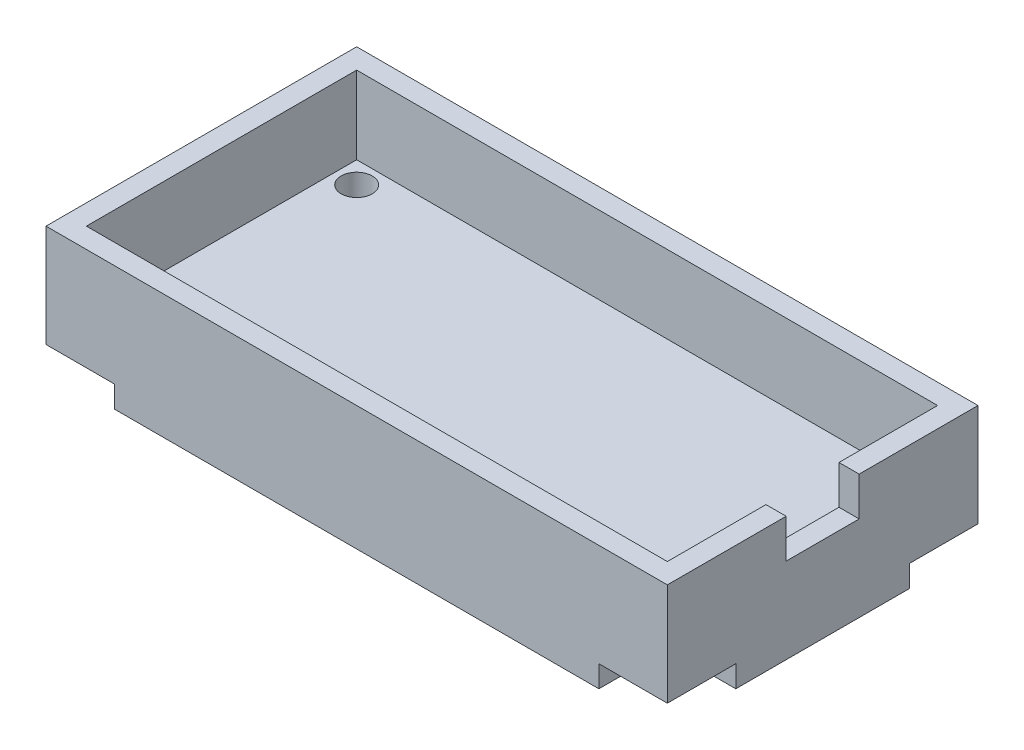
ISO-10303-21;
HEADER;
FILE_DESCRIPTION(('STEP AP214'),'2;1');
FILE_NAME('part.step','',(''),(''),'','','');
FILE_SCHEMA(('AUTOMOTIVE_DESIGN { 1 0 10303 214 1 1 1 1 }'));
ENDSEC;
DATA;
#1=APPLICATION_CONTEXT('core data for automotive mechanical design processes');
#2=APPLICATION_PROTOCOL_DEFINITION('international standard','automotive_design',2000,#1);
#3=PRODUCT_CONTEXT('',#1,'mechanical');
#4=PRODUCT('Part','Part','',(#3));
#5=PRODUCT_RELATED_PRODUCT_CATEGORY('part','',(#4));
#6=PRODUCT_DEFINITION_FORMATION('','',#4);
#7=PRODUCT_DEFINITION_CONTEXT('part definition',#1,'design');
#8=PRODUCT_DEFINITION('design','',#6,#7);
#9=PRODUCT_DEFINITION_SHAPE('','',#8);
#10=(LENGTH_UNIT() NAMED_UNIT(*) SI_UNIT(.MILLI.,.METRE.));
#11=(NAMED_UNIT(*) PLANE_ANGLE_UNIT() SI_UNIT($,.RADIAN.));
#12=(NAMED_UNIT(*) SI_UNIT($,.STERADIAN.) SOLID_ANGLE_UNIT());
#13=UNCERTAINTY_MEASURE_WITH_UNIT(LENGTH_MEASURE(1.E-05),#10,'distance_accuracy_value','');
#14=(GEOMETRIC_REPRESENTATION_CONTEXT(3) GLOBAL_UNCERTAINTY_ASSIGNED_CONTEXT((#13)) GLOBAL_UNIT_ASSIGNED_CONTEXT((#10,
#11,#12)) REPRESENTATION_CONTEXT('',''));
#15=CARTESIAN_POINT('',(0.,0.,0.));
#16=DIRECTION('',(0.,0.,1.));
#17=DIRECTION('',(1.,0.,0.));
#18=AXIS2_PLACEMENT_3D('',#15,#16,#17);
#19=CARTESIAN_POINT('',(2.7,8.,7.3));
#20=DIRECTION('',(0.,-1.,0.));
#21=DIRECTION('',(0.,0.,-1.));
#22=AXIS2_PLACEMENT_3D('',#19,#20,#21);
#23=CYLINDRICAL_SURFACE('',#22,0.999999999999998);
#24=CARTESIAN_POINT('',(2.7,3.,7.3));
#25=DIRECTION('',(0.,-1.,0.));
#26=DIRECTION('',(0.,0.,-1.));
#27=AXIS2_PLACEMENT_3D('',#24,#25,#26);
#28=CIRCLE('',#27,0.999999999999998);
#29=CARTESIAN_POINT('',(2.7,3.,6.3));
#30=VERTEX_POINT('',#29);
#31=EDGE_CURVE('E443',#30,#30,#28,.T.);
#32=ORIENTED_EDGE('',*,*,#31,.F.);
#33=EDGE_LOOP('',(#32));
#34=FACE_BOUND('',#33,.T.);
#35=CARTESIAN_POINT('',(2.7,1.4,7.3));
#36=DIRECTION('',(0.,-1.,0.));
#37=DIRECTION('',(0.,0.,-1.));
#38=AXIS2_PLACEMENT_3D('',#35,#36,#37);
#39=CIRCLE('',#38,0.999999999999998);
#40=CARTESIAN_POINT('',(2.7,1.4,6.3));
#41=VERTEX_POINT('',#40);
#42=EDGE_CURVE('E278',#41,#41,#39,.F.);
#43=ORIENTED_EDGE('',*,*,#42,.F.);
#44=EDGE_LOOP('',(#43));
#45=FACE_BOUND('',#44,.T.);
#46=ADVANCED_FACE('F31',(#34,#45),#23,.F.);
#47=CARTESIAN_POINT('',(37.3,8.,-7.29999999999999));
#48=DIRECTION('',(0.,-1.,0.));
#49=DIRECTION('',(0.,0.,-1.));
#50=AXIS2_PLACEMENT_3D('',#47,#48,#49);
#51=CYLINDRICAL_SURFACE('',#50,0.999999999999998);
#52=CARTESIAN_POINT('',(37.3,3.,-7.29999999999999));
#53=DIRECTION('',(0.,-1.,0.));
#54=DIRECTION('',(0.,0.,-1.));
#55=AXIS2_PLACEMENT_3D('',#52,#53,#54);
#56=CIRCLE('',#55,0.999999999999998);
#57=CARTESIAN_POINT('',(37.3,3.,-8.29999999999999));
#58=VERTEX_POINT('',#57);
#59=EDGE_CURVE('E437',#58,#58,#56,.T.);
#60=ORIENTED_EDGE('',*,*,#59,.F.);
#61=EDGE_LOOP('',(#60));
#62=FACE_BOUND('',#61,.T.);
#63=CARTESIAN_POINT('',(37.3,1.4,-7.29999999999999));
#64=DIRECTION('',(0.,-1.,0.));
#65=DIRECTION('',(0.,0.,-1.));
#66=AXIS2_PLACEMENT_3D('',#63,#64,#65);
#67=CIRCLE('',#66,0.999999999999998);
#68=CARTESIAN_POINT('',(37.3,1.4,-8.29999999999999));
#69=VERTEX_POINT('',#68);
#70=EDGE_CURVE('E343',#69,#69,#67,.F.);
#71=ORIENTED_EDGE('',*,*,#70,.F.);
#72=EDGE_LOOP('',(#71));
#73=FACE_BOUND('',#72,.T.);
#74=ADVANCED_FACE('F455',(#62,#73),#51,.F.);
#75=CARTESIAN_POINT('',(0.,8.,10.));
#76=DIRECTION('',(1.,0.,0.));
#77=DIRECTION('',(0.,1.,0.));
#78=AXIS2_PLACEMENT_3D('',#75,#76,#77);
#79=PLANE('',#78);
#80=DIRECTION('',(0.,0.,-1.));
#81=VECTOR('',#80,1.);
#82=CARTESIAN_POINT('',(0.,1.4,-10.));
#83=LINE('',#82,#81);
#84=CARTESIAN_POINT('',(0.,1.4,-5.59289321881345));
#85=VERTEX_POINT('',#84);
#86=CARTESIAN_POINT('',(0.,1.4,-10.));
#87=VERTEX_POINT('',#86);
#88=EDGE_CURVE('E48',#85,#87,#83,.T.);
#89=ORIENTED_EDGE('',*,*,#88,.F.);
#90=DIRECTION('',(0.,-1.,0.));
#91=VECTOR('',#90,1.);
#92=CARTESIAN_POINT('',(0.,1.4,-5.59289321881345));
#93=LINE('',#92,#91);
#94=CARTESIAN_POINT('',(0.,0.,-5.59289321881345));
#95=VERTEX_POINT('',#94);
#96=EDGE_CURVE('E230',#85,#95,#93,.T.);
#97=ORIENTED_EDGE('',*,*,#96,.T.);
#98=DIRECTION('',(0.,0.,-1.));
#99=VECTOR('',#98,1.);
#100=CARTESIAN_POINT('',(0.,0.,10.));
#101=LINE('',#100,#99);
#102=CARTESIAN_POINT('',(0.,0.,5.59289321881346));
#103=VERTEX_POINT('',#102);
#104=EDGE_CURVE('E11',#103,#95,#101,.T.);
#105=ORIENTED_EDGE('',*,*,#104,.F.);
#106=DIRECTION('',(0.,-1.,0.));
#107=VECTOR('',#106,1.);
#108=CARTESIAN_POINT('',(0.,1.4,5.59289321881346));
#109=LINE('',#108,#107);
#110=CARTESIAN_POINT('',(0.,1.4,5.59289321881346));
#111=VERTEX_POINT('',#110);
#112=EDGE_CURVE('E279',#111,#103,#109,.T.);
#113=ORIENTED_EDGE('',*,*,#112,.F.);
#114=DIRECTION('',(0.,0.,-1.));
#115=VECTOR('',#114,1.);
#116=CARTESIAN_POINT('',(0.,1.4,10.));
#117=LINE('',#116,#115);
#118=CARTESIAN_POINT('',(0.,1.4,10.));
#119=VERTEX_POINT('',#118);
#120=EDGE_CURVE('E263',#119,#111,#117,.T.);
#121=ORIENTED_EDGE('',*,*,#120,.F.);
#122=DIRECTION('',(0.,-1.,0.));
#123=VECTOR('',#122,1.);
#124=CARTESIAN_POINT('',(0.,8.,10.));
#125=LINE('',#124,#123);
#126=CARTESIAN_POINT('',(0.,8.,10.));
#127=VERTEX_POINT('',#126);
#128=EDGE_CURVE('E410',#127,#119,#125,.T.);
#129=ORIENTED_EDGE('',*,*,#128,.F.);
#130=DIRECTION('',(0.,0.,-1.));
#131=VECTOR('',#130,1.);
#132=CARTESIAN_POINT('',(0.,8.,10.));
#133=LINE('',#132,#131);
#134=CARTESIAN_POINT('',(0.,8.,-10.));
#135=VERTEX_POINT('',#134);
#136=EDGE_CURVE('E420',#127,#135,#133,.T.);
#137=ORIENTED_EDGE('',*,*,#136,.T.);
#138=DIRECTION('',(0.,-1.,0.));
#139=VECTOR('',#138,1.);
#140=CARTESIAN_POINT('',(0.,8.,-10.));
#141=LINE('',#140,#139);
#142=EDGE_CURVE('E403',#135,#87,#141,.T.);
#143=ORIENTED_EDGE('',*,*,#142,.T.);
#144=EDGE_LOOP('',(#89,#97,#105,#113,#121,#129,#137,#143));
#145=FACE_BOUND('',#144,.T.);
#146=ADVANCED_FACE('F33',(#145),#79,.F.);
#147=CARTESIAN_POINT('',(0.,0.,10.));
#148=DIRECTION('',(0.,1.,0.));
#149=DIRECTION('',(0.,0.,1.));
#150=AXIS2_PLACEMENT_3D('',#147,#148,#149);
#151=PLANE('',#150);
#152=CARTESIAN_POINT('',(3.40710678118655,0.,-6.59289321881345));
#153=DIRECTION('',(0.,-1.,0.));
#154=DIRECTION('',(0.,0.,1.));
#155=AXIS2_PLACEMENT_3D('',#152,#153,#154);
#156=CIRCLE('',#155,1.);
#157=CARTESIAN_POINT('',(4.40710678118656,0.,-6.59289321881345));
#158=VERTEX_POINT('',#157);
#159=CARTESIAN_POINT('',(3.40710678118655,0.,-5.59289321881345));
#160=VERTEX_POINT('',#159);
#161=EDGE_CURVE('E227',#158,#160,#156,.T.);
#162=ORIENTED_EDGE('',*,*,#161,.F.);
#163=DIRECTION('',(0.,0.,1.));
#164=VECTOR('',#163,1.);
#165=CARTESIAN_POINT('',(4.40710678118656,0.,-6.59289321881345));
#166=LINE('',#165,#164);
#167=CARTESIAN_POINT('',(4.40710678118656,0.,-10.));
#168=VERTEX_POINT('',#167);
#169=EDGE_CURVE('E240',#168,#158,#166,.T.);
#170=ORIENTED_EDGE('',*,*,#169,.F.);
#171=DIRECTION('',(1.,0.,0.));
#172=VECTOR('',#171,1.);
#173=CARTESIAN_POINT('',(0.,0.,-10.));
#174=LINE('',#173,#172);
#175=CARTESIAN_POINT('',(35.5928932188135,0.,-10.));
#176=VERTEX_POINT('',#175);
#177=EDGE_CURVE('E423',#168,#176,#174,.T.);
#178=ORIENTED_EDGE('',*,*,#177,.T.);
#179=DIRECTION('',(0.,0.,-1.));
#180=VECTOR('',#179,1.);
#181=CARTESIAN_POINT('',(35.5928932188135,0.,-6.59289321881345));
#182=LINE('',#181,#180);
#183=CARTESIAN_POINT('',(35.5928932188135,0.,-6.59289321881345));
#184=VERTEX_POINT('',#183);
#185=EDGE_CURVE('E321',#184,#176,#182,.T.);
#186=ORIENTED_EDGE('',*,*,#185,.F.);
#187=CARTESIAN_POINT('',(36.5928932188135,0.,-6.59289321881345));
#188=DIRECTION('',(0.,-1.,0.));
#189=DIRECTION('',(0.,0.,-1.));
#190=AXIS2_PLACEMENT_3D('',#187,#188,#189);
#191=CIRCLE('',#190,1.);
#192=CARTESIAN_POINT('',(36.5928932188135,0.,-5.59289321881345));
#193=VERTEX_POINT('',#192);
#194=EDGE_CURVE('E335',#193,#184,#191,.T.);
#195=ORIENTED_EDGE('',*,*,#194,.F.);
#196=DIRECTION('',(-1.,0.,0.));
#197=VECTOR('',#196,1.);
#198=CARTESIAN_POINT('',(40.,0.,-5.59289321881345));
#199=LINE('',#198,#197);
#200=CARTESIAN_POINT('',(40.,0.,-5.59289321881345));
#201=VERTEX_POINT('',#200);
#202=EDGE_CURVE('E332',#201,#193,#199,.T.);
#203=ORIENTED_EDGE('',*,*,#202,.F.);
#204=DIRECTION('',(0.,0.,-1.));
#205=VECTOR('',#204,1.);
#206=CARTESIAN_POINT('',(40.,0.,10.));
#207=LINE('',#206,#205);
#208=CARTESIAN_POINT('',(40.,0.,5.59289321881346));
#209=VERTEX_POINT('',#208);
#210=EDGE_CURVE('E40',#209,#201,#207,.T.);
#211=ORIENTED_EDGE('',*,*,#210,.F.);
#212=DIRECTION('',(1.,0.,0.));
#213=VECTOR('',#212,1.);
#214=CARTESIAN_POINT('',(40.,0.,5.59289321881346));
#215=LINE('',#214,#213);
#216=CARTESIAN_POINT('',(36.5928932188135,0.,5.59289321881346));
#217=VERTEX_POINT('',#216);
#218=EDGE_CURVE('E303',#217,#209,#215,.T.);
#219=ORIENTED_EDGE('',*,*,#218,.F.);
#220=CARTESIAN_POINT('',(36.5928932188135,0.,6.59289321881346));
#221=DIRECTION('',(0.,-1.,0.));
#222=DIRECTION('',(0.,0.,1.));
#223=AXIS2_PLACEMENT_3D('',#220,#221,#222);
#224=CIRCLE('',#223,1.);
#225=CARTESIAN_POINT('',(35.5928932188135,0.,6.59289321881346));
#226=VERTEX_POINT('',#225);
#227=EDGE_CURVE('E300',#226,#217,#224,.T.);
#228=ORIENTED_EDGE('',*,*,#227,.F.);
#229=DIRECTION('',(0.,0.,-1.));
#230=VECTOR('',#229,1.);
#231=CARTESIAN_POINT('',(35.5928932188135,0.,6.59289321881346));
#232=LINE('',#231,#230);
#233=CARTESIAN_POINT('',(35.5928932188135,0.,10.));
#234=VERTEX_POINT('',#233);
#235=EDGE_CURVE('E289',#234,#226,#232,.T.);
#236=ORIENTED_EDGE('',*,*,#235,.F.);
#237=DIRECTION('',(1.,0.,0.));
#238=VECTOR('',#237,1.);
#239=CARTESIAN_POINT('',(0.,0.,10.));
#240=LINE('',#239,#238);
#241=CARTESIAN_POINT('',(4.40710678118655,0.,10.));
#242=VERTEX_POINT('',#241);
#243=EDGE_CURVE('E413',#242,#234,#240,.T.);
#244=ORIENTED_EDGE('',*,*,#243,.F.);
#245=DIRECTION('',(0.,0.,1.));
#246=VECTOR('',#245,1.);
#247=CARTESIAN_POINT('',(4.40710678118656,0.,6.59289321881346));
#248=LINE('',#247,#246);
#249=CARTESIAN_POINT('',(4.40710678118656,0.,6.59289321881346));
#250=VERTEX_POINT('',#249);
#251=EDGE_CURVE('E272',#250,#242,#248,.T.);
#252=ORIENTED_EDGE('',*,*,#251,.F.);
#253=CARTESIAN_POINT('',(3.40710678118655,0.,6.59289321881346));
#254=DIRECTION('',(0.,-1.,0.));
#255=DIRECTION('',(0.,0.,-1.));
#256=AXIS2_PLACEMENT_3D('',#253,#254,#255);
#257=CIRCLE('',#256,1.);
#258=CARTESIAN_POINT('',(3.40710678118655,0.,5.59289321881346));
#259=VERTEX_POINT('',#258);
#260=EDGE_CURVE('E269',#259,#250,#257,.T.);
#261=ORIENTED_EDGE('',*,*,#260,.F.);
#262=DIRECTION('',(1.,0.,0.));
#263=VECTOR('',#262,1.);
#264=CARTESIAN_POINT('',(0.,0.,5.59289321881346));
#265=LINE('',#264,#263);
#266=EDGE_CURVE('E259',#103,#259,#265,.T.);
#267=ORIENTED_EDGE('',*,*,#266,.F.);
#268=ORIENTED_EDGE('',*,*,#104,.T.);
#269=DIRECTION('',(-1.,0.,0.));
#270=VECTOR('',#269,1.);
#271=CARTESIAN_POINT('',(0.,0.,-5.59289321881345));
#272=LINE('',#271,#270);
#273=EDGE_CURVE('E243',#160,#95,#272,.T.);
#274=ORIENTED_EDGE('',*,*,#273,.F.);
#275=EDGE_LOOP('',(#162,#170,#178,#186,#195,#203,#211,#219,#228,#236,#244,#252,#261,#267,#268,#274));
#276=FACE_BOUND('',#275,.T.);
#277=ADVANCED_FACE('F523',(#276),#151,.F.);
#278=CARTESIAN_POINT('',(40.,8.,10.));
#279=DIRECTION('',(-1.,0.,0.));
#280=DIRECTION('',(0.,-1.,0.));
#281=AXIS2_PLACEMENT_3D('',#278,#279,#280);
#282=PLANE('',#281);
#283=DIRECTION('',(0.,0.,1.));
#284=VECTOR('',#283,1.);
#285=CARTESIAN_POINT('',(40.,1.4,10.));
#286=LINE('',#285,#284);
#287=CARTESIAN_POINT('',(40.,1.4,5.59289321881346));
#288=VERTEX_POINT('',#287);
#289=CARTESIAN_POINT('',(40.,1.4,10.));
#290=VERTEX_POINT('',#289);
#291=EDGE_CURVE('E292',#288,#290,#286,.T.);
#292=ORIENTED_EDGE('',*,*,#291,.F.);
#293=DIRECTION('',(0.,-1.,0.));
#294=VECTOR('',#293,1.);
#295=CARTESIAN_POINT('',(40.,1.4,5.59289321881346));
#296=LINE('',#295,#294);
#297=EDGE_CURVE('E313',#288,#209,#296,.T.);
#298=ORIENTED_EDGE('',*,*,#297,.T.);
#299=ORIENTED_EDGE('',*,*,#210,.T.);
#300=DIRECTION('',(0.,-1.,0.));
#301=VECTOR('',#300,1.);
#302=CARTESIAN_POINT('',(40.,1.4,-5.59289321881345));
#303=LINE('',#302,#301);
#304=CARTESIAN_POINT('',(40.,1.4,-5.59289321881345));
#305=VERTEX_POINT('',#304);
#306=EDGE_CURVE('E331',#305,#201,#303,.T.);
#307=ORIENTED_EDGE('',*,*,#306,.F.);
#308=DIRECTION('',(0.,0.,1.));
#309=VECTOR('',#308,1.);
#310=CARTESIAN_POINT('',(40.,1.4,-10.));
#311=LINE('',#310,#309);
#312=CARTESIAN_POINT('',(40.,1.4,-10.));
#313=VERTEX_POINT('',#312);
#314=EDGE_CURVE('E317',#313,#305,#311,.T.);
#315=ORIENTED_EDGE('',*,*,#314,.F.);
#316=DIRECTION('',(0.,1.,0.));
#317=VECTOR('',#316,1.);
#318=CARTESIAN_POINT('',(40.,8.,-10.));
#319=LINE('',#318,#317);
#320=CARTESIAN_POINT('',(40.,8.,-10.));
#321=VERTEX_POINT('',#320);
#322=EDGE_CURVE('E425',#313,#321,#319,.T.);
#323=ORIENTED_EDGE('',*,*,#322,.T.);
#324=DIRECTION('',(0.,0.,-1.));
#325=VECTOR('',#324,1.);
#326=CARTESIAN_POINT('',(40.,8.,10.));
#327=LINE('',#326,#325);
#328=CARTESIAN_POINT('',(40.,8.,-2.35));
#329=VERTEX_POINT('',#328);
#330=EDGE_CURVE('E430',#329,#321,#327,.T.);
#331=ORIENTED_EDGE('',*,*,#330,.F.);
#332=DIRECTION('',(0.,1.,0.));
#333=VECTOR('',#332,1.);
#334=CARTESIAN_POINT('',(40.,5.5,-2.35));
#335=LINE('',#334,#333);
#336=CARTESIAN_POINT('',(40.,5.5,-2.35));
#337=VERTEX_POINT('',#336);
#338=EDGE_CURVE('E361',#337,#329,#335,.T.);
#339=ORIENTED_EDGE('',*,*,#338,.F.);
#340=DIRECTION('',(0.,0.,-1.));
#341=VECTOR('',#340,1.);
#342=CARTESIAN_POINT('',(40.,5.5,-2.35));
#343=LINE('',#342,#341);
#344=CARTESIAN_POINT('',(40.,5.5,2.35));
#345=VERTEX_POINT('',#344);
#346=EDGE_CURVE('E350',#345,#337,#343,.T.);
#347=ORIENTED_EDGE('',*,*,#346,.F.);
#348=DIRECTION('',(0.,1.,0.));
#349=VECTOR('',#348,1.);
#350=CARTESIAN_POINT('',(40.,5.5,2.35));
#351=LINE('',#350,#349);
#352=CARTESIAN_POINT('',(40.,8.,2.35));
#353=VERTEX_POINT('',#352);
#354=EDGE_CURVE('E366',#345,#353,#351,.T.);
#355=ORIENTED_EDGE('',*,*,#354,.T.);
#356=CARTESIAN_POINT('',(40.,8.,10.));
#357=VERTEX_POINT('',#356);
#358=EDGE_CURVE('E431',#357,#353,#327,.T.);
#359=ORIENTED_EDGE('',*,*,#358,.F.);
#360=DIRECTION('',(0.,1.,0.));
#361=VECTOR('',#360,1.);
#362=CARTESIAN_POINT('',(40.,8.,10.));
#363=LINE('',#362,#361);
#364=EDGE_CURVE('E416',#290,#357,#363,.T.);
#365=ORIENTED_EDGE('',*,*,#364,.F.);
#366=EDGE_LOOP('',(#292,#298,#299,#307,#315,#323,#331,#339,#347,#355,#359,#365));
#367=FACE_BOUND('',#366,.T.);
#368=ADVANCED_FACE('F520',(#367),#282,.F.);
#369=CARTESIAN_POINT('',(0.,8.,10.));
#370=DIRECTION('',(0.,-1.,0.));
#371=DIRECTION('',(0.,0.,-1.));
#372=AXIS2_PLACEMENT_3D('',#369,#370,#371);
#373=PLANE('',#372);
#374=ORIENTED_EDGE('',*,*,#358,.T.);
#375=DIRECTION('',(1.,0.,0.));
#376=VECTOR('',#375,1.);
#377=CARTESIAN_POINT('',(40.,8.,2.35));
#378=LINE('',#377,#376);
#379=CARTESIAN_POINT('',(38.7,8.,2.35));
#380=VERTEX_POINT('',#379);
#381=EDGE_CURVE('E354',#380,#353,#378,.T.);
#382=ORIENTED_EDGE('',*,*,#381,.F.);
#383=DIRECTION('',(0.,0.,-1.));
#384=VECTOR('',#383,1.);
#385=CARTESIAN_POINT('',(38.7,8.,-8.7));
#386=LINE('',#385,#384);
#387=CARTESIAN_POINT('',(38.7,8.,8.7));
#388=VERTEX_POINT('',#387);
#389=EDGE_CURVE('E390',#388,#380,#386,.T.);
#390=ORIENTED_EDGE('',*,*,#389,.F.);
#391=DIRECTION('',(1.,0.,0.));
#392=VECTOR('',#391,1.);
#393=CARTESIAN_POINT('',(38.7,8.,8.7));
#394=LINE('',#393,#392);
#395=CARTESIAN_POINT('',(1.30000000000001,8.,8.7));
#396=VERTEX_POINT('',#395);
#397=EDGE_CURVE('E380',#396,#388,#394,.T.);
#398=ORIENTED_EDGE('',*,*,#397,.F.);
#399=DIRECTION('',(0.,0.,1.));
#400=VECTOR('',#399,1.);
#401=CARTESIAN_POINT('',(1.30000000000001,8.,-8.7));
#402=LINE('',#401,#400);
#403=CARTESIAN_POINT('',(1.30000000000001,8.,-8.7));
#404=VERTEX_POINT('',#403);
#405=EDGE_CURVE('E396',#404,#396,#402,.T.);
#406=ORIENTED_EDGE('',*,*,#405,.F.);
#407=DIRECTION('',(-1.,0.,0.));
#408=VECTOR('',#407,1.);
#409=CARTESIAN_POINT('',(38.7,8.,-8.7));
#410=LINE('',#409,#408);
#411=CARTESIAN_POINT('',(38.7,8.,-8.7));
#412=VERTEX_POINT('',#411);
#413=EDGE_CURVE('E393',#412,#404,#410,.T.);
#414=ORIENTED_EDGE('',*,*,#413,.F.);
#415=CARTESIAN_POINT('',(38.7,8.,-2.35));
#416=VERTEX_POINT('',#415);
#417=EDGE_CURVE('E369',#416,#412,#386,.T.);
#418=ORIENTED_EDGE('',*,*,#417,.F.);
#419=DIRECTION('',(-1.,0.,0.));
#420=VECTOR('',#419,1.);
#421=CARTESIAN_POINT('',(40.,8.,-2.35));
#422=LINE('',#421,#420);
#423=EDGE_CURVE('E362',#329,#416,#422,.T.);
#424=ORIENTED_EDGE('',*,*,#423,.F.);
#425=ORIENTED_EDGE('',*,*,#330,.T.);
#426=DIRECTION('',(-1.,0.,0.));
#427=VECTOR('',#426,1.);
#428=CARTESIAN_POINT('',(0.,8.,-10.));
#429=LINE('',#428,#427);
#430=EDGE_CURVE('E414',#321,#135,#429,.T.);
#431=ORIENTED_EDGE('',*,*,#430,.T.);
#432=ORIENTED_EDGE('',*,*,#136,.F.);
#433=DIRECTION('',(-1.,0.,0.));
#434=VECTOR('',#433,1.);
#435=CARTESIAN_POINT('',(0.,8.,10.));
#436=LINE('',#435,#434);
#437=EDGE_CURVE('E418',#357,#127,#436,.T.);
#438=ORIENTED_EDGE('',*,*,#437,.F.);
#439=EDGE_LOOP('',(#374,#382,#390,#398,#406,#414,#418,#424,#425,#431,#432,#438));
#440=FACE_BOUND('',#439,.T.);
#441=ADVANCED_FACE('F513',(#440),#373,.F.);
#442=CARTESIAN_POINT('',(0.,0.,10.));
#443=DIRECTION('',(0.,0.,1.));
#444=DIRECTION('',(1.,0.,0.));
#445=AXIS2_PLACEMENT_3D('',#442,#443,#444);
#446=PLANE('',#445);
#447=DIRECTION('',(0.,-1.,0.));
#448=VECTOR('',#447,1.);
#449=CARTESIAN_POINT('',(4.40710678118655,1.4,10.));
#450=LINE('',#449,#448);
#451=CARTESIAN_POINT('',(4.40710678118656,1.4,10.));
#452=VERTEX_POINT('',#451);
#453=EDGE_CURVE('E281',#452,#242,#450,.T.);
#454=ORIENTED_EDGE('',*,*,#453,.T.);
#455=ORIENTED_EDGE('',*,*,#243,.T.);
#456=DIRECTION('',(0.,-1.,0.));
#457=VECTOR('',#456,1.);
#458=CARTESIAN_POINT('',(35.5928932188135,1.4,10.));
#459=LINE('',#458,#457);
#460=CARTESIAN_POINT('',(35.5928932188135,1.4,10.));
#461=VERTEX_POINT('',#460);
#462=EDGE_CURVE('E310',#461,#234,#459,.T.);
#463=ORIENTED_EDGE('',*,*,#462,.F.);
#464=DIRECTION('',(-1.,0.,0.));
#465=VECTOR('',#464,1.);
#466=CARTESIAN_POINT('',(35.5928932188135,1.4,10.));
#467=LINE('',#466,#465);
#468=EDGE_CURVE('E294',#290,#461,#467,.T.);
#469=ORIENTED_EDGE('',*,*,#468,.F.);
#470=ORIENTED_EDGE('',*,*,#364,.T.);
#471=ORIENTED_EDGE('',*,*,#437,.T.);
#472=ORIENTED_EDGE('',*,*,#128,.T.);
#473=DIRECTION('',(-1.,0.,0.));
#474=VECTOR('',#473,1.);
#475=CARTESIAN_POINT('',(4.40710678118655,1.4,10.));
#476=LINE('',#475,#474);
#477=EDGE_CURVE('E261',#452,#119,#476,.T.);
#478=ORIENTED_EDGE('',*,*,#477,.F.);
#479=EDGE_LOOP('',(#454,#455,#463,#469,#470,#471,#472,#478));
#480=FACE_BOUND('',#479,.T.);
#481=ADVANCED_FACE('F510',(#480),#446,.T.);
#482=CARTESIAN_POINT('',(0.,0.,-10.));
#483=DIRECTION('',(0.,0.,1.));
#484=DIRECTION('',(1.,0.,0.));
#485=AXIS2_PLACEMENT_3D('',#482,#483,#484);
#486=PLANE('',#485);
#487=ORIENTED_EDGE('',*,*,#177,.F.);
#488=DIRECTION('',(0.,-1.,0.));
#489=VECTOR('',#488,1.);
#490=CARTESIAN_POINT('',(4.40710678118656,1.4,-10.));
#491=LINE('',#490,#489);
#492=CARTESIAN_POINT('',(4.40710678118656,1.4,-10.));
#493=VERTEX_POINT('',#492);
#494=EDGE_CURVE('E254',#493,#168,#491,.T.);
#495=ORIENTED_EDGE('',*,*,#494,.F.);
#496=DIRECTION('',(1.,0.,0.));
#497=VECTOR('',#496,1.);
#498=CARTESIAN_POINT('',(4.40710678118656,1.4,-10.));
#499=LINE('',#498,#497);
#500=EDGE_CURVE('E247',#87,#493,#499,.T.);
#501=ORIENTED_EDGE('',*,*,#500,.F.);
#502=ORIENTED_EDGE('',*,*,#142,.F.);
#503=ORIENTED_EDGE('',*,*,#430,.F.);
#504=ORIENTED_EDGE('',*,*,#322,.F.);
#505=DIRECTION('',(1.,0.,0.));
#506=VECTOR('',#505,1.);
#507=CARTESIAN_POINT('',(35.5928932188135,1.4,-10.));
#508=LINE('',#507,#506);
#509=CARTESIAN_POINT('',(35.5928932188135,1.4,-10.));
#510=VERTEX_POINT('',#509);
#511=EDGE_CURVE('E329',#510,#313,#508,.T.);
#512=ORIENTED_EDGE('',*,*,#511,.F.);
#513=DIRECTION('',(0.,-1.,0.));
#514=VECTOR('',#513,1.);
#515=CARTESIAN_POINT('',(35.5928932188135,1.4,-10.));
#516=LINE('',#515,#514);
#517=EDGE_CURVE('E340',#510,#176,#516,.T.);
#518=ORIENTED_EDGE('',*,*,#517,.T.);
#519=EDGE_LOOP('',(#487,#495,#501,#502,#503,#504,#512,#518));
#520=FACE_BOUND('',#519,.T.);
#521=ADVANCED_FACE('F508',(#520),#486,.F.);
#522=CARTESIAN_POINT('',(38.7,3.,-8.7));
#523=DIRECTION('',(1.,0.,0.));
#524=DIRECTION('',(0.,0.,-1.));
#525=AXIS2_PLACEMENT_3D('',#522,#523,#524);
#526=PLANE('',#525);
#527=ORIENTED_EDGE('',*,*,#389,.T.);
#528=DIRECTION('',(0.,1.,0.));
#529=VECTOR('',#528,1.);
#530=CARTESIAN_POINT('',(38.7,5.5,2.35));
#531=LINE('',#530,#529);
#532=CARTESIAN_POINT('',(38.7,5.5,2.35));
#533=VERTEX_POINT('',#532);
#534=EDGE_CURVE('E370',#533,#380,#531,.T.);
#535=ORIENTED_EDGE('',*,*,#534,.F.);
#536=DIRECTION('',(0.,0.,1.));
#537=VECTOR('',#536,1.);
#538=CARTESIAN_POINT('',(38.7,5.5,-2.35));
#539=LINE('',#538,#537);
#540=CARTESIAN_POINT('',(38.7,5.5,-2.35));
#541=VERTEX_POINT('',#540);
#542=EDGE_CURVE('E356',#541,#533,#539,.T.);
#543=ORIENTED_EDGE('',*,*,#542,.F.);
#544=DIRECTION('',(0.,1.,0.));
#545=VECTOR('',#544,1.);
#546=CARTESIAN_POINT('',(38.7,5.5,-2.35));
#547=LINE('',#546,#545);
#548=EDGE_CURVE('E372',#541,#416,#547,.T.);
#549=ORIENTED_EDGE('',*,*,#548,.T.);
#550=ORIENTED_EDGE('',*,*,#417,.T.);
#551=DIRECTION('',(0.,1.,0.));
#552=VECTOR('',#551,1.);
#553=CARTESIAN_POINT('',(38.7,3.,-8.7));
#554=LINE('',#553,#552);
#555=CARTESIAN_POINT('',(38.7,3.,-8.7));
#556=VERTEX_POINT('',#555);
#557=EDGE_CURVE('E389',#556,#412,#554,.T.);
#558=ORIENTED_EDGE('',*,*,#557,.F.);
#559=DIRECTION('',(0.,0.,-1.));
#560=VECTOR('',#559,1.);
#561=CARTESIAN_POINT('',(38.7,3.,-8.7));
#562=LINE('',#561,#560);
#563=CARTESIAN_POINT('',(38.7,3.,8.7));
#564=VERTEX_POINT('',#563);
#565=EDGE_CURVE('E376',#564,#556,#562,.T.);
#566=ORIENTED_EDGE('',*,*,#565,.F.);
#567=DIRECTION('',(0.,1.,0.));
#568=VECTOR('',#567,1.);
#569=CARTESIAN_POINT('',(38.7,3.,8.7));
#570=LINE('',#569,#568);
#571=EDGE_CURVE('E401',#564,#388,#570,.T.);
#572=ORIENTED_EDGE('',*,*,#571,.T.);
#573=EDGE_LOOP('',(#527,#535,#543,#549,#550,#558,#566,#572));
#574=FACE_BOUND('',#573,.T.);
#575=ADVANCED_FACE('F498',(#574),#526,.F.);
#576=CARTESIAN_POINT('',(38.7,3.,8.7));
#577=DIRECTION('',(0.,0.,1.));
#578=DIRECTION('',(1.,0.,0.));
#579=AXIS2_PLACEMENT_3D('',#576,#577,#578);
#580=PLANE('',#579);
#581=ORIENTED_EDGE('',*,*,#397,.T.);
#582=ORIENTED_EDGE('',*,*,#571,.F.);
#583=DIRECTION('',(1.,0.,0.));
#584=VECTOR('',#583,1.);
#585=CARTESIAN_POINT('',(38.7,3.,8.7));
#586=LINE('',#585,#584);
#587=CARTESIAN_POINT('',(1.30000000000001,3.,8.7));
#588=VERTEX_POINT('',#587);
#589=EDGE_CURVE('E386',#588,#564,#586,.T.);
#590=ORIENTED_EDGE('',*,*,#589,.F.);
#591=DIRECTION('',(0.,1.,0.));
#592=VECTOR('',#591,1.);
#593=CARTESIAN_POINT('',(1.30000000000001,3.,8.7));
#594=LINE('',#593,#592);
#595=EDGE_CURVE('E404',#588,#396,#594,.T.);
#596=ORIENTED_EDGE('',*,*,#595,.T.);
#597=EDGE_LOOP('',(#581,#582,#590,#596));
#598=FACE_BOUND('',#597,.T.);
#599=ADVANCED_FACE('F494',(#598),#580,.F.);
#600=CARTESIAN_POINT('',(1.30000000000001,3.,-8.7));
#601=DIRECTION('',(-1.,0.,0.));
#602=DIRECTION('',(0.,0.,1.));
#603=AXIS2_PLACEMENT_3D('',#600,#601,#602);
#604=PLANE('',#603);
#605=ORIENTED_EDGE('',*,*,#405,.T.);
#606=ORIENTED_EDGE('',*,*,#595,.F.);
#607=DIRECTION('',(0.,0.,1.));
#608=VECTOR('',#607,1.);
#609=CARTESIAN_POINT('',(1.30000000000001,3.,-8.7));
#610=LINE('',#609,#608);
#611=CARTESIAN_POINT('',(1.30000000000001,3.,-8.7));
#612=VERTEX_POINT('',#611);
#613=EDGE_CURVE('E383',#612,#588,#610,.T.);
#614=ORIENTED_EDGE('',*,*,#613,.F.);
#615=DIRECTION('',(0.,1.,0.));
#616=VECTOR('',#615,1.);
#617=CARTESIAN_POINT('',(1.30000000000001,3.,-8.7));
#618=LINE('',#617,#616);
#619=EDGE_CURVE('E406',#612,#404,#618,.T.);
#620=ORIENTED_EDGE('',*,*,#619,.T.);
#621=EDGE_LOOP('',(#605,#606,#614,#620));
#622=FACE_BOUND('',#621,.T.);
#623=ADVANCED_FACE('F497',(#622),#604,.F.);
#624=CARTESIAN_POINT('',(38.7,3.,-8.7));
#625=DIRECTION('',(0.,0.,-1.));
#626=DIRECTION('',(-1.,0.,0.));
#627=AXIS2_PLACEMENT_3D('',#624,#625,#626);
#628=PLANE('',#627);
#629=ORIENTED_EDGE('',*,*,#413,.T.);
#630=ORIENTED_EDGE('',*,*,#619,.F.);
#631=DIRECTION('',(-1.,0.,0.));
#632=VECTOR('',#631,1.);
#633=CARTESIAN_POINT('',(38.7,3.,-8.7));
#634=LINE('',#633,#632);
#635=EDGE_CURVE('E379',#556,#612,#634,.T.);
#636=ORIENTED_EDGE('',*,*,#635,.F.);
#637=ORIENTED_EDGE('',*,*,#557,.T.);
#638=EDGE_LOOP('',(#629,#630,#636,#637));
#639=FACE_BOUND('',#638,.T.);
#640=ADVANCED_FACE('F492',(#639),#628,.F.);
#641=CARTESIAN_POINT('',(38.7,3.,8.7));
#642=DIRECTION('',(0.,-1.,0.));
#643=DIRECTION('',(0.,0.,-1.));
#644=AXIS2_PLACEMENT_3D('',#641,#642,#643);
#645=PLANE('',#644);
#646=ORIENTED_EDGE('',*,*,#31,.T.);
#647=EDGE_LOOP('',(#646));
#648=FACE_BOUND('',#647,.T.);
#649=CARTESIAN_POINT('',(2.70000000000001,3.,-7.29999999999999));
#650=DIRECTION('',(0.,-1.,0.));
#651=DIRECTION('',(0.,0.,-1.));
#652=AXIS2_PLACEMENT_3D('',#649,#650,#651);
#653=CIRCLE('',#652,0.999999999999998);
#654=CARTESIAN_POINT('',(2.70000000000001,3.,-8.29999999999999));
#655=VERTEX_POINT('',#654);
#656=EDGE_CURVE('E440',#655,#655,#653,.T.);
#657=ORIENTED_EDGE('',*,*,#656,.T.);
#658=EDGE_LOOP('',(#657));
#659=FACE_BOUND('',#658,.T.);
#660=ORIENTED_EDGE('',*,*,#59,.T.);
#661=EDGE_LOOP('',(#660));
#662=FACE_BOUND('',#661,.T.);
#663=CARTESIAN_POINT('',(37.3,3.,7.3));
#664=DIRECTION('',(0.,-1.,0.));
#665=DIRECTION('',(0.,0.,-1.));
#666=AXIS2_PLACEMENT_3D('',#663,#664,#665);
#667=CIRCLE('',#666,0.999999999999998);
#668=CARTESIAN_POINT('',(37.3,3.,6.3));
#669=VERTEX_POINT('',#668);
#670=EDGE_CURVE('E364',#669,#669,#667,.T.);
#671=ORIENTED_EDGE('',*,*,#670,.T.);
#672=EDGE_LOOP('',(#671));
#673=FACE_BOUND('',#672,.T.);
#674=ORIENTED_EDGE('',*,*,#565,.T.);
#675=ORIENTED_EDGE('',*,*,#635,.T.);
#676=ORIENTED_EDGE('',*,*,#613,.T.);
#677=ORIENTED_EDGE('',*,*,#589,.T.);
#678=EDGE_LOOP('',(#674,#675,#676,#677));
#679=FACE_BOUND('',#678,.T.);
#680=ADVANCED_FACE('F485',(#648,#659,#662,#673,#679),#645,.F.);
#681=CARTESIAN_POINT('',(40.,5.5,2.35));
#682=DIRECTION('',(0.,0.,1.));
#683=DIRECTION('',(1.,0.,0.));
#684=AXIS2_PLACEMENT_3D('',#681,#682,#683);
#685=PLANE('',#684);
#686=ORIENTED_EDGE('',*,*,#381,.T.);
#687=ORIENTED_EDGE('',*,*,#354,.F.);
#688=DIRECTION('',(1.,0.,0.));
#689=VECTOR('',#688,1.);
#690=CARTESIAN_POINT('',(40.,5.5,2.35));
#691=LINE('',#690,#689);
#692=EDGE_CURVE('E358',#533,#345,#691,.T.);
#693=ORIENTED_EDGE('',*,*,#692,.F.);
#694=ORIENTED_EDGE('',*,*,#534,.T.);
#695=EDGE_LOOP('',(#686,#687,#693,#694));
#696=FACE_BOUND('',#695,.T.);
#697=ADVANCED_FACE('F482',(#696),#685,.F.);
#698=CARTESIAN_POINT('',(40.,5.5,-2.35));
#699=DIRECTION('',(0.,0.,-1.));
#700=DIRECTION('',(-1.,0.,0.));
#701=AXIS2_PLACEMENT_3D('',#698,#699,#700);
#702=PLANE('',#701);
#703=ORIENTED_EDGE('',*,*,#423,.T.);
#704=ORIENTED_EDGE('',*,*,#548,.F.);
#705=DIRECTION('',(-1.,0.,0.));
#706=VECTOR('',#705,1.);
#707=CARTESIAN_POINT('',(40.,5.5,-2.35));
#708=LINE('',#707,#706);
#709=EDGE_CURVE('E353',#337,#541,#708,.T.);
#710=ORIENTED_EDGE('',*,*,#709,.F.);
#711=ORIENTED_EDGE('',*,*,#338,.T.);
#712=EDGE_LOOP('',(#703,#704,#710,#711));
#713=FACE_BOUND('',#712,.T.);
#714=ADVANCED_FACE('F480',(#713),#702,.F.);
#715=CARTESIAN_POINT('',(40.,5.5,2.35));
#716=DIRECTION('',(0.,-1.,0.));
#717=DIRECTION('',(0.,0.,-1.));
#718=AXIS2_PLACEMENT_3D('',#715,#716,#717);
#719=PLANE('',#718);
#720=ORIENTED_EDGE('',*,*,#346,.T.);
#721=ORIENTED_EDGE('',*,*,#709,.T.);
#722=ORIENTED_EDGE('',*,*,#542,.T.);
#723=ORIENTED_EDGE('',*,*,#692,.T.);
#724=EDGE_LOOP('',(#720,#721,#722,#723));
#725=FACE_BOUND('',#724,.T.);
#726=ADVANCED_FACE('F476',(#725),#719,.F.);
#727=CARTESIAN_POINT('',(37.3,8.,7.3));
#728=DIRECTION('',(0.,-1.,0.));
#729=DIRECTION('',(0.,0.,-1.));
#730=AXIS2_PLACEMENT_3D('',#727,#728,#729);
#731=CYLINDRICAL_SURFACE('',#730,0.999999999999998);
#732=CARTESIAN_POINT('',(37.3,1.4,7.3));
#733=DIRECTION('',(0.,1.,0.));
#734=DIRECTION('',(0.,0.,1.));
#735=AXIS2_PLACEMENT_3D('',#732,#733,#734);
#736=CIRCLE('',#735,0.999999999999998);
#737=CARTESIAN_POINT('',(37.3,1.4,8.3));
#738=VERTEX_POINT('',#737);
#739=EDGE_CURVE('E309',#738,#738,#736,.F.);
#740=ORIENTED_EDGE('',*,*,#739,.T.);
#741=EDGE_LOOP('',(#740));
#742=FACE_BOUND('',#741,.T.);
#743=ORIENTED_EDGE('',*,*,#670,.F.);
#744=EDGE_LOOP('',(#743));
#745=FACE_BOUND('',#744,.T.);
#746=ADVANCED_FACE('F471',(#742,#745),#731,.F.);
#747=CARTESIAN_POINT('',(2.70000000000001,8.,-7.29999999999999));
#748=DIRECTION('',(0.,-1.,0.));
#749=DIRECTION('',(0.,0.,-1.));
#750=AXIS2_PLACEMENT_3D('',#747,#748,#749);
#751=CYLINDRICAL_SURFACE('',#750,0.999999999999998);
#752=CARTESIAN_POINT('',(2.70000000000001,1.4,-7.29999999999999));
#753=DIRECTION('',(0.,1.,0.));
#754=DIRECTION('',(0.,0.,1.));
#755=AXIS2_PLACEMENT_3D('',#752,#753,#754);
#756=CIRCLE('',#755,0.999999999999998);
#757=CARTESIAN_POINT('',(2.70000000000001,1.4,-6.29999999999999));
#758=VERTEX_POINT('',#757);
#759=EDGE_CURVE('E35',#758,#758,#756,.F.);
#760=ORIENTED_EDGE('',*,*,#759,.T.);
#761=EDGE_LOOP('',(#760));
#762=FACE_BOUND('',#761,.T.);
#763=ORIENTED_EDGE('',*,*,#656,.F.);
#764=EDGE_LOOP('',(#763));
#765=FACE_BOUND('',#764,.T.);
#766=ADVANCED_FACE('F468',(#762,#765),#751,.F.);
#767=CARTESIAN_POINT('',(36.5928932188135,1.4,-6.59289321881345));
#768=DIRECTION('',(0.,-1.,0.));
#769=DIRECTION('',(0.,0.,-1.));
#770=AXIS2_PLACEMENT_3D('',#767,#768,#769);
#771=PLANE('',#770);
#772=ORIENTED_EDGE('',*,*,#314,.T.);
#773=DIRECTION('',(-1.,0.,0.));
#774=VECTOR('',#773,1.);
#775=CARTESIAN_POINT('',(40.,1.4,-5.59289321881345));
#776=LINE('',#775,#774);
#777=CARTESIAN_POINT('',(36.5928932188135,1.4,-5.59289321881345));
#778=VERTEX_POINT('',#777);
#779=EDGE_CURVE('E320',#305,#778,#776,.T.);
#780=ORIENTED_EDGE('',*,*,#779,.T.);
#781=CARTESIAN_POINT('',(36.5928932188135,1.4,-6.59289321881345));
#782=DIRECTION('',(0.,-1.,0.));
#783=DIRECTION('',(0.,0.,-1.));
#784=AXIS2_PLACEMENT_3D('',#781,#782,#783);
#785=CIRCLE('',#784,1.);
#786=CARTESIAN_POINT('',(35.5928932188135,1.4,-6.59289321881345));
#787=VERTEX_POINT('',#786);
#788=EDGE_CURVE('E324',#778,#787,#785,.T.);
#789=ORIENTED_EDGE('',*,*,#788,.T.);
#790=DIRECTION('',(0.,0.,-1.));
#791=VECTOR('',#790,1.);
#792=CARTESIAN_POINT('',(35.5928932188135,1.4,-6.59289321881345));
#793=LINE('',#792,#791);
#794=EDGE_CURVE('E327',#787,#510,#793,.T.);
#795=ORIENTED_EDGE('',*,*,#794,.T.);
#796=ORIENTED_EDGE('',*,*,#511,.T.);
#797=EDGE_LOOP('',(#772,#780,#789,#795,#796));
#798=FACE_BOUND('',#797,.T.);
#799=ORIENTED_EDGE('',*,*,#70,.T.);
#800=EDGE_LOOP('',(#799));
#801=FACE_BOUND('',#800,.T.);
#802=ADVANCED_FACE('F470',(#798,#801),#771,.T.);
#803=CARTESIAN_POINT('',(35.5928932188135,1.4,-6.59289321881345));
#804=DIRECTION('',(-1.,0.,0.));
#805=DIRECTION('',(0.,0.,1.));
#806=AXIS2_PLACEMENT_3D('',#803,#804,#805);
#807=PLANE('',#806);
#808=ORIENTED_EDGE('',*,*,#185,.T.);
#809=ORIENTED_EDGE('',*,*,#517,.F.);
#810=ORIENTED_EDGE('',*,*,#794,.F.);
#811=DIRECTION('',(0.,-1.,0.));
#812=VECTOR('',#811,1.);
#813=CARTESIAN_POINT('',(35.5928932188135,1.4,-6.59289321881345));
#814=LINE('',#813,#812);
#815=EDGE_CURVE('E344',#787,#184,#814,.T.);
#816=ORIENTED_EDGE('',*,*,#815,.T.);
#817=EDGE_LOOP('',(#808,#809,#810,#816));
#818=FACE_BOUND('',#817,.T.);
#819=ADVANCED_FACE('F586',(#818),#807,.F.);
#820=CARTESIAN_POINT('',(36.5928932188135,1.4,-6.59289321881345));
#821=DIRECTION('',(0.,-1.,0.));
#822=DIRECTION('',(0.,0.,-1.));
#823=AXIS2_PLACEMENT_3D('',#820,#821,#822);
#824=CYLINDRICAL_SURFACE('',#823,1.);
#825=ORIENTED_EDGE('',*,*,#194,.T.);
#826=ORIENTED_EDGE('',*,*,#815,.F.);
#827=ORIENTED_EDGE('',*,*,#788,.F.);
#828=DIRECTION('',(0.,-1.,0.));
#829=VECTOR('',#828,1.);
#830=CARTESIAN_POINT('',(36.5928932188135,1.4,-5.59289321881345));
#831=LINE('',#830,#829);
#832=EDGE_CURVE('E346',#778,#193,#831,.T.);
#833=ORIENTED_EDGE('',*,*,#832,.T.);
#834=EDGE_LOOP('',(#825,#826,#827,#833));
#835=FACE_BOUND('',#834,.T.);
#836=ADVANCED_FACE('F589',(#835),#824,.F.);
#837=CARTESIAN_POINT('',(40.,1.4,-5.59289321881345));
#838=DIRECTION('',(0.,0.,1.));
#839=DIRECTION('',(1.,0.,0.));
#840=AXIS2_PLACEMENT_3D('',#837,#838,#839);
#841=PLANE('',#840);
#842=ORIENTED_EDGE('',*,*,#202,.T.);
#843=ORIENTED_EDGE('',*,*,#832,.F.);
#844=ORIENTED_EDGE('',*,*,#779,.F.);
#845=ORIENTED_EDGE('',*,*,#306,.T.);
#846=EDGE_LOOP('',(#842,#843,#844,#845));
#847=FACE_BOUND('',#846,.T.);
#848=ADVANCED_FACE('F466',(#847),#841,.F.);
#849=CARTESIAN_POINT('',(36.5928932188135,1.4,6.59289321881346));
#850=DIRECTION('',(0.,1.,0.));
#851=DIRECTION('',(0.,0.,1.));
#852=AXIS2_PLACEMENT_3D('',#849,#850,#851);
#853=PLANE('',#852);
#854=CARTESIAN_POINT('',(36.5928932188135,1.4,6.59289321881346));
#855=DIRECTION('',(0.,-1.,0.));
#856=DIRECTION('',(0.,0.,1.));
#857=AXIS2_PLACEMENT_3D('',#854,#855,#856);
#858=CIRCLE('',#857,1.);
#859=CARTESIAN_POINT('',(35.5928932188135,1.4,6.59289321881346));
#860=VERTEX_POINT('',#859);
#861=CARTESIAN_POINT('',(36.5928932188135,1.4,5.59289321881346));
#862=VERTEX_POINT('',#861);
#863=EDGE_CURVE('E285',#860,#862,#858,.T.);
#864=ORIENTED_EDGE('',*,*,#863,.T.);
#865=DIRECTION('',(1.,0.,0.));
#866=VECTOR('',#865,1.);
#867=CARTESIAN_POINT('',(40.,1.4,5.59289321881346));
#868=LINE('',#867,#866);
#869=EDGE_CURVE('E288',#862,#288,#868,.T.);
#870=ORIENTED_EDGE('',*,*,#869,.T.);
#871=ORIENTED_EDGE('',*,*,#291,.T.);
#872=ORIENTED_EDGE('',*,*,#468,.T.);
#873=DIRECTION('',(0.,0.,-1.));
#874=VECTOR('',#873,1.);
#875=CARTESIAN_POINT('',(35.5928932188135,1.4,6.59289321881346));
#876=LINE('',#875,#874);
#877=EDGE_CURVE('E296',#461,#860,#876,.T.);
#878=ORIENTED_EDGE('',*,*,#877,.T.);
#879=EDGE_LOOP('',(#864,#870,#871,#872,#878));
#880=FACE_BOUND('',#879,.T.);
#881=ORIENTED_EDGE('',*,*,#739,.F.);
#882=EDGE_LOOP('',(#881));
#883=FACE_BOUND('',#882,.T.);
#884=ADVANCED_FACE('F569',(#880,#883),#853,.F.);
#885=CARTESIAN_POINT('',(36.5928932188135,1.4,6.59289321881346));
#886=DIRECTION('',(0.,-1.,0.));
#887=DIRECTION('',(0.,0.,-1.));
#888=AXIS2_PLACEMENT_3D('',#885,#886,#887);
#889=CYLINDRICAL_SURFACE('',#888,1.);
#890=ORIENTED_EDGE('',*,*,#227,.T.);
#891=DIRECTION('',(0.,-1.,0.));
#892=VECTOR('',#891,1.);
#893=CARTESIAN_POINT('',(36.5928932188135,1.4,5.59289321881346));
#894=LINE('',#893,#892);
#895=EDGE_CURVE('E299',#862,#217,#894,.T.);
#896=ORIENTED_EDGE('',*,*,#895,.F.);
#897=ORIENTED_EDGE('',*,*,#863,.F.);
#898=DIRECTION('',(0.,-1.,0.));
#899=VECTOR('',#898,1.);
#900=CARTESIAN_POINT('',(35.5928932188135,1.4,6.59289321881346));
#901=LINE('',#900,#899);
#902=EDGE_CURVE('E307',#860,#226,#901,.T.);
#903=ORIENTED_EDGE('',*,*,#902,.T.);
#904=EDGE_LOOP('',(#890,#896,#897,#903));
#905=FACE_BOUND('',#904,.T.);
#906=ADVANCED_FACE('F572',(#905),#889,.F.);
#907=CARTESIAN_POINT('',(35.5928932188135,1.4,6.59289321881346));
#908=DIRECTION('',(-1.,0.,0.));
#909=DIRECTION('',(0.,0.,1.));
#910=AXIS2_PLACEMENT_3D('',#907,#908,#909);
#911=PLANE('',#910);
#912=ORIENTED_EDGE('',*,*,#235,.T.);
#913=ORIENTED_EDGE('',*,*,#902,.F.);
#914=ORIENTED_EDGE('',*,*,#877,.F.);
#915=ORIENTED_EDGE('',*,*,#462,.T.);
#916=EDGE_LOOP('',(#912,#913,#914,#915));
#917=FACE_BOUND('',#916,.T.);
#918=ADVANCED_FACE('F574',(#917),#911,.F.);
#919=CARTESIAN_POINT('',(40.,1.4,5.59289321881346));
#920=DIRECTION('',(0.,0.,-1.));
#921=DIRECTION('',(-1.,0.,0.));
#922=AXIS2_PLACEMENT_3D('',#919,#920,#921);
#923=PLANE('',#922);
#924=ORIENTED_EDGE('',*,*,#218,.T.);
#925=ORIENTED_EDGE('',*,*,#297,.F.);
#926=ORIENTED_EDGE('',*,*,#869,.F.);
#927=ORIENTED_EDGE('',*,*,#895,.T.);
#928=EDGE_LOOP('',(#924,#925,#926,#927));
#929=FACE_BOUND('',#928,.T.);
#930=ADVANCED_FACE('F557',(#929),#923,.F.);
#931=CARTESIAN_POINT('',(3.40710678118655,1.4,6.59289321881346));
#932=DIRECTION('',(0.,-1.,0.));
#933=DIRECTION('',(0.,0.,-1.));
#934=AXIS2_PLACEMENT_3D('',#931,#932,#933);
#935=PLANE('',#934);
#936=CARTESIAN_POINT('',(3.40710678118655,1.4,6.59289321881346));
#937=DIRECTION('',(0.,-1.,0.));
#938=DIRECTION('',(0.,0.,-1.));
#939=AXIS2_PLACEMENT_3D('',#936,#937,#938);
#940=CIRCLE('',#939,1.);
#941=CARTESIAN_POINT('',(3.40710678118655,1.4,5.59289321881346));
#942=VERTEX_POINT('',#941);
#943=CARTESIAN_POINT('',(4.40710678118656,1.4,6.59289321881346));
#944=VERTEX_POINT('',#943);
#945=EDGE_CURVE('E257',#942,#944,#940,.T.);
#946=ORIENTED_EDGE('',*,*,#945,.T.);
#947=DIRECTION('',(0.,0.,1.));
#948=VECTOR('',#947,1.);
#949=CARTESIAN_POINT('',(4.40710678118656,1.4,6.59289321881346));
#950=LINE('',#949,#948);
#951=EDGE_CURVE('E56',#944,#452,#950,.T.);
#952=ORIENTED_EDGE('',*,*,#951,.T.);
#953=ORIENTED_EDGE('',*,*,#477,.T.);
#954=ORIENTED_EDGE('',*,*,#120,.T.);
#955=DIRECTION('',(1.,0.,0.));
#956=VECTOR('',#955,1.);
#957=CARTESIAN_POINT('',(0.,1.4,5.59289321881346));
#958=LINE('',#957,#956);
#959=EDGE_CURVE('E265',#111,#942,#958,.T.);
#960=ORIENTED_EDGE('',*,*,#959,.T.);
#961=EDGE_LOOP('',(#946,#952,#953,#954,#960));
#962=FACE_BOUND('',#961,.T.);
#963=ORIENTED_EDGE('',*,*,#42,.T.);
#964=EDGE_LOOP('',(#963));
#965=FACE_BOUND('',#964,.T.);
#966=ADVANCED_FACE('F452',(#962,#965),#935,.T.);
#967=CARTESIAN_POINT('',(3.40710678118655,1.4,6.59289321881346));
#968=DIRECTION('',(0.,-1.,0.));
#969=DIRECTION('',(0.,0.,-1.));
#970=AXIS2_PLACEMENT_3D('',#967,#968,#969);
#971=CYLINDRICAL_SURFACE('',#970,1.);
#972=ORIENTED_EDGE('',*,*,#260,.T.);
#973=DIRECTION('',(0.,-1.,0.));
#974=VECTOR('',#973,1.);
#975=CARTESIAN_POINT('',(4.40710678118656,1.4,6.59289321881346));
#976=LINE('',#975,#974);
#977=EDGE_CURVE('E268',#944,#250,#976,.T.);
#978=ORIENTED_EDGE('',*,*,#977,.F.);
#979=ORIENTED_EDGE('',*,*,#945,.F.);
#980=DIRECTION('',(0.,-1.,0.));
#981=VECTOR('',#980,1.);
#982=CARTESIAN_POINT('',(3.40710678118655,1.4,5.59289321881346));
#983=LINE('',#982,#981);
#984=EDGE_CURVE('E276',#942,#259,#983,.T.);
#985=ORIENTED_EDGE('',*,*,#984,.T.);
#986=EDGE_LOOP('',(#972,#978,#979,#985));
#987=FACE_BOUND('',#986,.T.);
#988=ADVANCED_FACE('F556',(#987),#971,.F.);
#989=CARTESIAN_POINT('',(0.,1.4,5.59289321881346));
#990=DIRECTION('',(0.,0.,-1.));
#991=DIRECTION('',(-1.,0.,0.));
#992=AXIS2_PLACEMENT_3D('',#989,#990,#991);
#993=PLANE('',#992);
#994=ORIENTED_EDGE('',*,*,#266,.T.);
#995=ORIENTED_EDGE('',*,*,#984,.F.);
#996=ORIENTED_EDGE('',*,*,#959,.F.);
#997=ORIENTED_EDGE('',*,*,#112,.T.);
#998=EDGE_LOOP('',(#994,#995,#996,#997));
#999=FACE_BOUND('',#998,.T.);
#1000=ADVANCED_FACE('F558',(#999),#993,.F.);
#1001=CARTESIAN_POINT('',(4.40710678118656,1.4,6.59289321881346));
#1002=DIRECTION('',(1.,0.,0.));
#1003=DIRECTION('',(0.,0.,-1.));
#1004=AXIS2_PLACEMENT_3D('',#1001,#1002,#1003);
#1005=PLANE('',#1004);
#1006=ORIENTED_EDGE('',*,*,#251,.T.);
#1007=ORIENTED_EDGE('',*,*,#453,.F.);
#1008=ORIENTED_EDGE('',*,*,#951,.F.);
#1009=ORIENTED_EDGE('',*,*,#977,.T.);
#1010=EDGE_LOOP('',(#1006,#1007,#1008,#1009));
#1011=FACE_BOUND('',#1010,.T.);
#1012=ADVANCED_FACE('F561',(#1011),#1005,.F.);
#1013=CARTESIAN_POINT('',(3.40710678118655,1.4,-6.59289321881345));
#1014=DIRECTION('',(0.,1.,0.));
#1015=DIRECTION('',(0.,0.,1.));
#1016=AXIS2_PLACEMENT_3D('',#1013,#1014,#1015);
#1017=PLANE('',#1016);
#1018=CARTESIAN_POINT('',(3.40710678118655,1.4,-6.59289321881345));
#1019=DIRECTION('',(0.,-1.,0.));
#1020=DIRECTION('',(0.,0.,1.));
#1021=AXIS2_PLACEMENT_3D('',#1018,#1019,#1020);
#1022=CIRCLE('',#1021,1.);
#1023=CARTESIAN_POINT('',(4.40710678118656,1.4,-6.59289321881345));
#1024=VERTEX_POINT('',#1023);
#1025=CARTESIAN_POINT('',(3.40710678118655,1.4,-5.59289321881345));
#1026=VERTEX_POINT('',#1025);
#1027=EDGE_CURVE('E224',#1024,#1026,#1022,.T.);
#1028=ORIENTED_EDGE('',*,*,#1027,.T.);
#1029=DIRECTION('',(-1.,0.,0.));
#1030=VECTOR('',#1029,1.);
#1031=CARTESIAN_POINT('',(0.,1.4,-5.59289321881345));
#1032=LINE('',#1031,#1030);
#1033=EDGE_CURVE('E233',#1026,#85,#1032,.T.);
#1034=ORIENTED_EDGE('',*,*,#1033,.T.);
#1035=ORIENTED_EDGE('',*,*,#88,.T.);
#1036=ORIENTED_EDGE('',*,*,#500,.T.);
#1037=DIRECTION('',(0.,0.,1.));
#1038=VECTOR('',#1037,1.);
#1039=CARTESIAN_POINT('',(4.40710678118656,1.4,-6.59289321881345));
#1040=LINE('',#1039,#1038);
#1041=EDGE_CURVE('E231',#493,#1024,#1040,.T.);
#1042=ORIENTED_EDGE('',*,*,#1041,.T.);
#1043=EDGE_LOOP('',(#1028,#1034,#1035,#1036,#1042));
#1044=FACE_BOUND('',#1043,.T.);
#1045=ORIENTED_EDGE('',*,*,#759,.F.);
#1046=EDGE_LOOP('',(#1045));
#1047=FACE_BOUND('',#1046,.T.);
#1048=ADVANCED_FACE('F237',(#1044,#1047),#1017,.F.);
#1049=CARTESIAN_POINT('',(3.40710678118655,1.4,-6.59289321881345));
#1050=DIRECTION('',(0.,-1.,0.));
#1051=DIRECTION('',(0.,0.,-1.));
#1052=AXIS2_PLACEMENT_3D('',#1049,#1050,#1051);
#1053=CYLINDRICAL_SURFACE('',#1052,1.);
#1054=ORIENTED_EDGE('',*,*,#161,.T.);
#1055=DIRECTION('',(0.,-1.,0.));
#1056=VECTOR('',#1055,1.);
#1057=CARTESIAN_POINT('',(3.40710678118655,1.4,-5.59289321881345));
#1058=LINE('',#1057,#1056);
#1059=EDGE_CURVE('E220',#1026,#160,#1058,.T.);
#1060=ORIENTED_EDGE('',*,*,#1059,.F.);
#1061=ORIENTED_EDGE('',*,*,#1027,.F.);
#1062=DIRECTION('',(0.,-1.,0.));
#1063=VECTOR('',#1062,1.);
#1064=CARTESIAN_POINT('',(4.40710678118656,1.4,-6.59289321881345));
#1065=LINE('',#1064,#1063);
#1066=EDGE_CURVE('E252',#1024,#158,#1065,.T.);
#1067=ORIENTED_EDGE('',*,*,#1066,.T.);
#1068=EDGE_LOOP('',(#1054,#1060,#1061,#1067));
#1069=FACE_BOUND('',#1068,.T.);
#1070=ADVANCED_FACE('F222',(#1069),#1053,.F.);
#1071=CARTESIAN_POINT('',(4.40710678118656,1.4,-6.59289321881345));
#1072=DIRECTION('',(1.,0.,0.));
#1073=DIRECTION('',(0.,0.,-1.));
#1074=AXIS2_PLACEMENT_3D('',#1071,#1072,#1073);
#1075=PLANE('',#1074);
#1076=ORIENTED_EDGE('',*,*,#169,.T.);
#1077=ORIENTED_EDGE('',*,*,#1066,.F.);
#1078=ORIENTED_EDGE('',*,*,#1041,.F.);
#1079=ORIENTED_EDGE('',*,*,#494,.T.);
#1080=EDGE_LOOP('',(#1076,#1077,#1078,#1079));
#1081=FACE_BOUND('',#1080,.T.);
#1082=ADVANCED_FACE('F543',(#1081),#1075,.F.);
#1083=CARTESIAN_POINT('',(0.,1.4,-5.59289321881345));
#1084=DIRECTION('',(0.,0.,1.));
#1085=DIRECTION('',(1.,0.,0.));
#1086=AXIS2_PLACEMENT_3D('',#1083,#1084,#1085);
#1087=PLANE('',#1086);
#1088=ORIENTED_EDGE('',*,*,#273,.T.);
#1089=ORIENTED_EDGE('',*,*,#96,.F.);
#1090=ORIENTED_EDGE('',*,*,#1033,.F.);
#1091=ORIENTED_EDGE('',*,*,#1059,.T.);
#1092=EDGE_LOOP('',(#1088,#1089,#1090,#1091));
#1093=FACE_BOUND('',#1092,.T.);
#1094=ADVANCED_FACE('F234',(#1093),#1087,.F.);
#1095=CLOSED_SHELL('',(#46,#74,#146,#277,#368,#441,#481,#521,#575,#599,#623,#640,#680,#697,#714,
#726,#746,#766,#802,#819,#836,#848,#884,#906,#918,#930,#966,#988,#1000,#1012,#1048,#1070,#1082,#1094));
#1096=MANIFOLD_SOLID_BREP('B2',#1095);
#1097=ADVANCED_BREP_SHAPE_REPRESENTATION('',(#18,#1096),#14);
#1098=SHAPE_DEFINITION_REPRESENTATION(#9,#1097);
ENDSEC;
END-ISO-10303-21;
